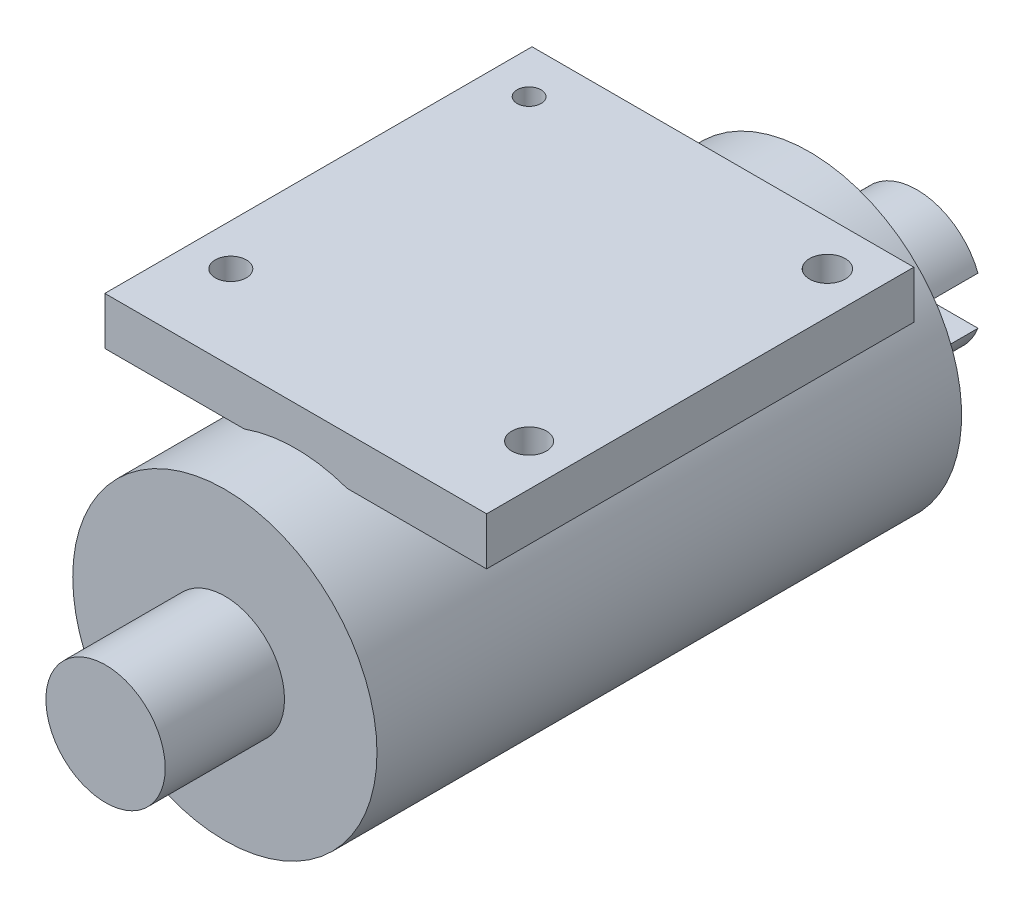
ISO-10303-21;
HEADER;
FILE_DESCRIPTION(('STEP AP214'),'2;1');
FILE_NAME('part.step','',(''),(''),'','','');
FILE_SCHEMA(('AUTOMOTIVE_DESIGN { 1 0 10303 214 1 1 1 1 }'));
ENDSEC;
DATA;
#1=APPLICATION_CONTEXT('core data for automotive mechanical design processes');
#2=APPLICATION_PROTOCOL_DEFINITION('international standard','automotive_design',2000,#1);
#3=PRODUCT_CONTEXT('',#1,'mechanical');
#4=PRODUCT('Part','Part','',(#3));
#5=PRODUCT_RELATED_PRODUCT_CATEGORY('part','',(#4));
#6=PRODUCT_DEFINITION_FORMATION('','',#4);
#7=PRODUCT_DEFINITION_CONTEXT('part definition',#1,'design');
#8=PRODUCT_DEFINITION('design','',#6,#7);
#9=PRODUCT_DEFINITION_SHAPE('','',#8);
#10=(LENGTH_UNIT() NAMED_UNIT(*) SI_UNIT(.MILLI.,.METRE.));
#11=(NAMED_UNIT(*) PLANE_ANGLE_UNIT() SI_UNIT($,.RADIAN.));
#12=(NAMED_UNIT(*) SI_UNIT($,.STERADIAN.) SOLID_ANGLE_UNIT());
#13=UNCERTAINTY_MEASURE_WITH_UNIT(LENGTH_MEASURE(1.E-05),#10,'distance_accuracy_value','');
#14=(GEOMETRIC_REPRESENTATION_CONTEXT(3) GLOBAL_UNCERTAINTY_ASSIGNED_CONTEXT((#13)) GLOBAL_UNIT_ASSIGNED_CONTEXT((#10,
#11,#12)) REPRESENTATION_CONTEXT('',''));
#15=CARTESIAN_POINT('',(0.,0.,0.));
#16=DIRECTION('',(0.,0.,1.));
#17=DIRECTION('',(1.,0.,0.));
#18=AXIS2_PLACEMENT_3D('',#15,#16,#17);
#19=CARTESIAN_POINT('',(0.,0.,116.));
#20=DIRECTION('',(0.,0.,1.));
#21=DIRECTION('',(1.,0.,0.));
#22=AXIS2_PLACEMENT_3D('',#19,#20,#21);
#23=PLANE('',#22);
#24=CARTESIAN_POINT('',(0.,0.,116.));
#25=DIRECTION('',(0.,0.,1.));
#26=DIRECTION('',(1.,0.,0.));
#27=AXIS2_PLACEMENT_3D('',#24,#25,#26);
#28=CIRCLE('',#27,25.5);
#29=CARTESIAN_POINT('',(25.5,0.,116.));
#30=VERTEX_POINT('',#29);
#31=EDGE_CURVE('E177',#30,#30,#28,.T.);
#32=ORIENTED_EDGE('',*,*,#31,.T.);
#33=EDGE_LOOP('',(#32));
#34=FACE_BOUND('',#33,.T.);
#35=CARTESIAN_POINT('',(0.,0.,116.));
#36=DIRECTION('',(0.,0.,1.));
#37=DIRECTION('',(1.,0.,0.));
#38=AXIS2_PLACEMENT_3D('',#35,#36,#37);
#39=CIRCLE('',#38,10.);
#40=CARTESIAN_POINT('',(10.,0.,116.));
#41=VERTEX_POINT('',#40);
#42=EDGE_CURVE('E311',#41,#41,#39,.T.);
#43=ORIENTED_EDGE('',*,*,#42,.F.);
#44=EDGE_LOOP('',(#43));
#45=FACE_BOUND('',#44,.T.);
#46=ADVANCED_FACE('F33',(#34,#45),#23,.T.);
#47=CARTESIAN_POINT('',(0.,0.,116.));
#48=DIRECTION('',(0.,0.,-1.));
#49=DIRECTION('',(-1.,0.,0.));
#50=AXIS2_PLACEMENT_3D('',#47,#48,#49);
#51=CYLINDRICAL_SURFACE('',#50,25.5);
#52=CARTESIAN_POINT('',(0.,0.,18.));
#53=DIRECTION('',(0.,0.,-1.));
#54=DIRECTION('',(-1.,0.,0.));
#55=AXIS2_PLACEMENT_3D('',#52,#53,#54);
#56=CIRCLE('',#55,25.5);
#57=CARTESIAN_POINT('',(-25.5,0.,18.));
#58=VERTEX_POINT('',#57);
#59=EDGE_CURVE('E173',#58,#58,#56,.T.);
#60=ORIENTED_EDGE('',*,*,#59,.F.);
#61=EDGE_LOOP('',(#60));
#62=FACE_BOUND('',#61,.T.);
#63=ORIENTED_EDGE('',*,*,#31,.F.);
#64=EDGE_LOOP('',(#63));
#65=FACE_BOUND('',#64,.T.);
#66=DIRECTION('',(0.,0.,-1.));
#67=VECTOR('',#66,1.);
#68=CARTESIAN_POINT('',(8.61684396980703,24.,116.));
#69=LINE('',#68,#67);
#70=CARTESIAN_POINT('',(8.61684396980704,24.,104.119231033455));
#71=VERTEX_POINT('',#70);
#72=CARTESIAN_POINT('',(8.61684396980704,24.,32.51129718235));
#73=VERTEX_POINT('',#72);
#74=EDGE_CURVE('E12',#71,#73,#69,.T.);
#75=ORIENTED_EDGE('',*,*,#74,.F.);
#76=CARTESIAN_POINT('',(0.,0.,104.119231033455));
#77=DIRECTION('',(0.,0.,1.));
#78=DIRECTION('',(1.,0.,0.));
#79=AXIS2_PLACEMENT_3D('',#76,#77,#78);
#80=CIRCLE('',#79,25.5);
#81=CARTESIAN_POINT('',(-8.61684396980703,24.,104.119231033455));
#82=VERTEX_POINT('',#81);
#83=EDGE_CURVE('E192',#71,#82,#80,.T.);
#84=ORIENTED_EDGE('',*,*,#83,.T.);
#85=DIRECTION('',(0.,0.,-1.));
#86=VECTOR('',#85,1.);
#87=CARTESIAN_POINT('',(-8.61684396980703,24.,116.));
#88=LINE('',#87,#86);
#89=CARTESIAN_POINT('',(-8.61684396980703,24.,32.51129718235));
#90=VERTEX_POINT('',#89);
#91=EDGE_CURVE('E124',#90,#82,#88,.F.);
#92=ORIENTED_EDGE('',*,*,#91,.F.);
#93=CARTESIAN_POINT('',(0.,0.,32.51129718235));
#94=DIRECTION('',(0.,0.,-1.));
#95=DIRECTION('',(-1.,0.,0.));
#96=AXIS2_PLACEMENT_3D('',#93,#94,#95);
#97=CIRCLE('',#96,25.5);
#98=EDGE_CURVE('E41',#90,#73,#97,.T.);
#99=ORIENTED_EDGE('',*,*,#98,.T.);
#100=EDGE_LOOP('',(#75,#84,#92,#99));
#101=FACE_BOUND('',#100,.T.);
#102=ADVANCED_FACE('F35',(#62,#65,#101),#51,.T.);
#103=CARTESIAN_POINT('',(0.,0.,0.));
#104=DIRECTION('',(0.,0.,1.));
#105=DIRECTION('',(1.,0.,0.));
#106=AXIS2_PLACEMENT_3D('',#103,#104,#105);
#107=PLANE('',#106);
#108=CARTESIAN_POINT('',(0.,0.,0.));
#109=DIRECTION('',(0.,0.,-1.));
#110=DIRECTION('',(-1.,0.,0.));
#111=AXIS2_PLACEMENT_3D('',#108,#109,#110);
#112=CIRCLE('',#111,11.);
#113=CARTESIAN_POINT('',(-10.2469507659596,4.,0.));
#114=VERTEX_POINT('',#113);
#115=CARTESIAN_POINT('',(10.2469507659596,4.,0.));
#116=VERTEX_POINT('',#115);
#117=EDGE_CURVE('E174',#114,#116,#112,.T.);
#118=ORIENTED_EDGE('',*,*,#117,.T.);
#119=DIRECTION('',(-1.,0.,0.));
#120=VECTOR('',#119,1.);
#121=CARTESIAN_POINT('',(0.,4.,0.));
#122=LINE('',#121,#120);
#123=EDGE_CURVE('E185',#116,#114,#122,.T.);
#124=ORIENTED_EDGE('',*,*,#123,.T.);
#125=EDGE_LOOP('',(#118,#124));
#126=FACE_BOUND('',#125,.T.);
#127=ADVANCED_FACE('F226',(#126),#107,.F.);
#128=CARTESIAN_POINT('',(0.,0.,18.));
#129=DIRECTION('',(0.,0.,-1.));
#130=DIRECTION('',(-1.,0.,0.));
#131=AXIS2_PLACEMENT_3D('',#128,#129,#130);
#132=PLANE('',#131);
#133=CARTESIAN_POINT('',(0.,0.,18.));
#134=DIRECTION('',(0.,0.,-1.));
#135=DIRECTION('',(-1.,0.,0.));
#136=AXIS2_PLACEMENT_3D('',#133,#134,#135);
#137=CIRCLE('',#136,11.);
#138=CARTESIAN_POINT('',(-11.,0.,18.));
#139=VERTEX_POINT('',#138);
#140=EDGE_CURVE('E170',#139,#139,#137,.T.);
#141=ORIENTED_EDGE('',*,*,#140,.F.);
#142=EDGE_LOOP('',(#141));
#143=FACE_BOUND('',#142,.T.);
#144=ORIENTED_EDGE('',*,*,#59,.T.);
#145=EDGE_LOOP('',(#144));
#146=FACE_BOUND('',#145,.T.);
#147=ADVANCED_FACE('F230',(#143,#146),#132,.T.);
#148=CARTESIAN_POINT('',(0.,0.,18.));
#149=DIRECTION('',(0.,0.,-1.));
#150=DIRECTION('',(-1.,0.,0.));
#151=AXIS2_PLACEMENT_3D('',#148,#149,#150);
#152=CYLINDRICAL_SURFACE('',#151,11.);
#153=DIRECTION('',(0.,0.,-1.));
#154=VECTOR('',#153,1.);
#155=CARTESIAN_POINT('',(-10.2469507659596,4.,18.));
#156=LINE('',#155,#154);
#157=CARTESIAN_POINT('',(-10.2469507659596,4.,12.));
#158=VERTEX_POINT('',#157);
#159=EDGE_CURVE('E165',#158,#114,#156,.T.);
#160=ORIENTED_EDGE('',*,*,#159,.F.);
#161=CARTESIAN_POINT('',(0.,0.,12.));
#162=DIRECTION('',(0.,0.,1.));
#163=DIRECTION('',(1.,0.,0.));
#164=AXIS2_PLACEMENT_3D('',#161,#162,#163);
#165=CIRCLE('',#164,11.);
#166=CARTESIAN_POINT('',(-10.2469507659596,-4.,12.));
#167=VERTEX_POINT('',#166);
#168=EDGE_CURVE('E190',#167,#158,#165,.F.);
#169=ORIENTED_EDGE('',*,*,#168,.F.);
#170=DIRECTION('',(0.,0.,-1.));
#171=VECTOR('',#170,1.);
#172=CARTESIAN_POINT('',(-10.2469507659596,-4.,18.));
#173=LINE('',#172,#171);
#174=CARTESIAN_POINT('',(-10.2469507659596,-4.,0.));
#175=VERTEX_POINT('',#174);
#176=EDGE_CURVE('E163',#175,#167,#173,.F.);
#177=ORIENTED_EDGE('',*,*,#176,.F.);
#178=CARTESIAN_POINT('',(10.2469507659596,-4.,0.));
#179=VERTEX_POINT('',#178);
#180=EDGE_CURVE('E169',#179,#175,#112,.T.);
#181=ORIENTED_EDGE('',*,*,#180,.F.);
#182=DIRECTION('',(0.,0.,-1.));
#183=VECTOR('',#182,1.);
#184=CARTESIAN_POINT('',(10.2469507659596,-4.,18.));
#185=LINE('',#184,#183);
#186=CARTESIAN_POINT('',(10.2469507659596,-4.,12.));
#187=VERTEX_POINT('',#186);
#188=EDGE_CURVE('E161',#187,#179,#185,.T.);
#189=ORIENTED_EDGE('',*,*,#188,.F.);
#190=CARTESIAN_POINT('',(10.2469507659596,4.,12.));
#191=VERTEX_POINT('',#190);
#192=EDGE_CURVE('E188',#191,#187,#165,.F.);
#193=ORIENTED_EDGE('',*,*,#192,.F.);
#194=DIRECTION('',(0.,0.,-1.));
#195=VECTOR('',#194,1.);
#196=CARTESIAN_POINT('',(10.2469507659596,4.,18.));
#197=LINE('',#196,#195);
#198=EDGE_CURVE('E167',#116,#191,#197,.F.);
#199=ORIENTED_EDGE('',*,*,#198,.F.);
#200=ORIENTED_EDGE('',*,*,#117,.F.);
#201=EDGE_LOOP('',(#160,#169,#177,#181,#189,#193,#199,#200));
#202=FACE_BOUND('',#201,.T.);
#203=ORIENTED_EDGE('',*,*,#140,.T.);
#204=EDGE_LOOP('',(#203));
#205=FACE_BOUND('',#204,.T.);
#206=ADVANCED_FACE('F235',(#202,#205),#152,.T.);
#207=ORIENTED_EDGE('',*,*,#180,.T.);
#208=DIRECTION('',(1.,0.,0.));
#209=VECTOR('',#208,1.);
#210=CARTESIAN_POINT('',(0.,-4.,0.));
#211=LINE('',#210,#209);
#212=EDGE_CURVE('E180',#175,#179,#211,.T.);
#213=ORIENTED_EDGE('',*,*,#212,.T.);
#214=EDGE_LOOP('',(#207,#213));
#215=FACE_BOUND('',#214,.T.);
#216=ADVANCED_FACE('F232',(#215),#107,.F.);
#217=CARTESIAN_POINT('',(20.3856403488771,4.,12.));
#218=DIRECTION('',(0.,1.,0.));
#219=DIRECTION('',(0.,0.,1.));
#220=AXIS2_PLACEMENT_3D('',#217,#218,#219);
#221=PLANE('',#220);
#222=ORIENTED_EDGE('',*,*,#198,.T.);
#223=DIRECTION('',(1.,0.,0.));
#224=VECTOR('',#223,1.);
#225=CARTESIAN_POINT('',(20.3856403488771,4.,12.));
#226=LINE('',#225,#224);
#227=EDGE_CURVE('E158',#158,#191,#226,.T.);
#228=ORIENTED_EDGE('',*,*,#227,.F.);
#229=ORIENTED_EDGE('',*,*,#159,.T.);
#230=ORIENTED_EDGE('',*,*,#123,.F.);
#231=EDGE_LOOP('',(#222,#228,#229,#230));
#232=FACE_BOUND('',#231,.T.);
#233=ADVANCED_FACE('F234',(#232),#221,.F.);
#234=CARTESIAN_POINT('',(20.3856403488771,-4.,12.));
#235=DIRECTION('',(0.,-1.,0.));
#236=DIRECTION('',(0.,0.,-1.));
#237=AXIS2_PLACEMENT_3D('',#234,#235,#236);
#238=PLANE('',#237);
#239=ORIENTED_EDGE('',*,*,#176,.T.);
#240=DIRECTION('',(-1.,0.,0.));
#241=VECTOR('',#240,1.);
#242=CARTESIAN_POINT('',(20.3856403488771,-4.,12.));
#243=LINE('',#242,#241);
#244=EDGE_CURVE('E152',#187,#167,#243,.T.);
#245=ORIENTED_EDGE('',*,*,#244,.F.);
#246=ORIENTED_EDGE('',*,*,#188,.T.);
#247=ORIENTED_EDGE('',*,*,#212,.F.);
#248=EDGE_LOOP('',(#239,#245,#246,#247));
#249=FACE_BOUND('',#248,.T.);
#250=ADVANCED_FACE('F215',(#249),#238,.F.);
#251=CARTESIAN_POINT('',(20.3856403488771,4.,12.));
#252=DIRECTION('',(0.,0.,1.));
#253=DIRECTION('',(1.,0.,0.));
#254=AXIS2_PLACEMENT_3D('',#251,#252,#253);
#255=PLANE('',#254);
#256=ORIENTED_EDGE('',*,*,#168,.T.);
#257=ORIENTED_EDGE('',*,*,#227,.T.);
#258=ORIENTED_EDGE('',*,*,#192,.T.);
#259=ORIENTED_EDGE('',*,*,#244,.T.);
#260=EDGE_LOOP('',(#256,#257,#258,#259));
#261=FACE_BOUND('',#260,.T.);
#262=ADVANCED_FACE('F208',(#261),#255,.F.);
#263=CARTESIAN_POINT('',(-32.,24.,32.51129718235));
#264=DIRECTION('',(0.,0.,-1.));
#265=DIRECTION('',(-1.,0.,0.));
#266=AXIS2_PLACEMENT_3D('',#263,#264,#265);
#267=PLANE('',#266);
#268=ORIENTED_EDGE('',*,*,#98,.F.);
#269=DIRECTION('',(-1.,0.,0.));
#270=VECTOR('',#269,1.);
#271=CARTESIAN_POINT('',(-32.,24.,32.51129718235));
#272=LINE('',#271,#270);
#273=CARTESIAN_POINT('',(-32.,24.,32.51129718235));
#274=VERTEX_POINT('',#273);
#275=EDGE_CURVE('E142',#90,#274,#272,.T.);
#276=ORIENTED_EDGE('',*,*,#275,.T.);
#277=DIRECTION('',(0.,1.,0.));
#278=VECTOR('',#277,1.);
#279=CARTESIAN_POINT('',(-32.,24.,32.51129718235));
#280=LINE('',#279,#278);
#281=CARTESIAN_POINT('',(-32.,32.,32.51129718235));
#282=VERTEX_POINT('',#281);
#283=EDGE_CURVE('E130',#274,#282,#280,.T.);
#284=ORIENTED_EDGE('',*,*,#283,.T.);
#285=DIRECTION('',(-1.,0.,0.));
#286=VECTOR('',#285,1.);
#287=CARTESIAN_POINT('',(-32.,32.,32.51129718235));
#288=LINE('',#287,#286);
#289=CARTESIAN_POINT('',(32.,32.,32.51129718235));
#290=VERTEX_POINT('',#289);
#291=EDGE_CURVE('E131',#290,#282,#288,.T.);
#292=ORIENTED_EDGE('',*,*,#291,.F.);
#293=DIRECTION('',(0.,1.,0.));
#294=VECTOR('',#293,1.);
#295=CARTESIAN_POINT('',(32.,24.,32.51129718235));
#296=LINE('',#295,#294);
#297=CARTESIAN_POINT('',(32.,24.,32.51129718235));
#298=VERTEX_POINT('',#297);
#299=EDGE_CURVE('E153',#298,#290,#296,.T.);
#300=ORIENTED_EDGE('',*,*,#299,.F.);
#301=EDGE_CURVE('E116',#298,#73,#272,.T.);
#302=ORIENTED_EDGE('',*,*,#301,.T.);
#303=EDGE_LOOP('',(#268,#276,#284,#292,#300,#302));
#304=FACE_BOUND('',#303,.T.);
#305=ADVANCED_FACE('F206',(#304),#267,.T.);
#306=CARTESIAN_POINT('',(-32.,24.,104.119231033455));
#307=DIRECTION('',(0.,0.,1.));
#308=DIRECTION('',(1.,0.,0.));
#309=AXIS2_PLACEMENT_3D('',#306,#307,#308);
#310=PLANE('',#309);
#311=ORIENTED_EDGE('',*,*,#83,.F.);
#312=DIRECTION('',(1.,0.,0.));
#313=VECTOR('',#312,1.);
#314=CARTESIAN_POINT('',(-32.,24.,104.119231033455));
#315=LINE('',#314,#313);
#316=CARTESIAN_POINT('',(32.,24.,104.119231033455));
#317=VERTEX_POINT('',#316);
#318=EDGE_CURVE('E126',#71,#317,#315,.T.);
#319=ORIENTED_EDGE('',*,*,#318,.T.);
#320=DIRECTION('',(0.,1.,0.));
#321=VECTOR('',#320,1.);
#322=CARTESIAN_POINT('',(32.,24.,104.119231033455));
#323=LINE('',#322,#321);
#324=CARTESIAN_POINT('',(32.,32.,104.119231033455));
#325=VERTEX_POINT('',#324);
#326=EDGE_CURVE('E115',#317,#325,#323,.T.);
#327=ORIENTED_EDGE('',*,*,#326,.T.);
#328=DIRECTION('',(1.,0.,0.));
#329=VECTOR('',#328,1.);
#330=CARTESIAN_POINT('',(-32.,32.,104.119231033455));
#331=LINE('',#330,#329);
#332=CARTESIAN_POINT('',(-32.,32.,104.119231033455));
#333=VERTEX_POINT('',#332);
#334=EDGE_CURVE('E110',#333,#325,#331,.T.);
#335=ORIENTED_EDGE('',*,*,#334,.F.);
#336=DIRECTION('',(0.,1.,0.));
#337=VECTOR('',#336,1.);
#338=CARTESIAN_POINT('',(-32.,24.,104.119231033455));
#339=LINE('',#338,#337);
#340=CARTESIAN_POINT('',(-32.,24.,104.119231033455));
#341=VERTEX_POINT('',#340);
#342=EDGE_CURVE('E105',#341,#333,#339,.T.);
#343=ORIENTED_EDGE('',*,*,#342,.F.);
#344=EDGE_CURVE('E108',#341,#82,#315,.T.);
#345=ORIENTED_EDGE('',*,*,#344,.T.);
#346=EDGE_LOOP('',(#311,#319,#327,#335,#343,#345));
#347=FACE_BOUND('',#346,.T.);
#348=ADVANCED_FACE('F107',(#347),#310,.T.);
#349=CARTESIAN_POINT('',(-32.,24.,104.119231033455));
#350=DIRECTION('',(0.,1.,0.));
#351=DIRECTION('',(0.,0.,1.));
#352=AXIS2_PLACEMENT_3D('',#349,#350,#351);
#353=PLANE('',#352);
#354=CARTESIAN_POINT('',(25.,24.,90.));
#355=DIRECTION('',(0.,1.,0.));
#356=DIRECTION('',(0.,0.,1.));
#357=AXIS2_PLACEMENT_3D('',#354,#355,#356);
#358=CIRCLE('',#357,2.91025978255613);
#359=CARTESIAN_POINT('',(25.,24.,92.9102597825561));
#360=VERTEX_POINT('',#359);
#361=EDGE_CURVE('E147',#360,#360,#358,.T.);
#362=ORIENTED_EDGE('',*,*,#361,.T.);
#363=EDGE_LOOP('',(#362));
#364=FACE_BOUND('',#363,.T.);
#365=CARTESIAN_POINT('',(25.,24.,40.));
#366=DIRECTION('',(0.,1.,0.));
#367=DIRECTION('',(0.,0.,1.));
#368=AXIS2_PLACEMENT_3D('',#365,#366,#367);
#369=CIRCLE('',#368,2.98778185505247);
#370=CARTESIAN_POINT('',(25.,24.,42.9877818550525));
#371=VERTEX_POINT('',#370);
#372=EDGE_CURVE('E328',#371,#371,#369,.T.);
#373=ORIENTED_EDGE('',*,*,#372,.T.);
#374=EDGE_LOOP('',(#373));
#375=FACE_BOUND('',#374,.T.);
#376=ORIENTED_EDGE('',*,*,#318,.F.);
#377=ORIENTED_EDGE('',*,*,#74,.T.);
#378=ORIENTED_EDGE('',*,*,#301,.F.);
#379=DIRECTION('',(0.,0.,-1.));
#380=VECTOR('',#379,1.);
#381=CARTESIAN_POINT('',(32.,24.,32.51129718235));
#382=LINE('',#381,#380);
#383=EDGE_CURVE('E125',#317,#298,#382,.T.);
#384=ORIENTED_EDGE('',*,*,#383,.F.);
#385=EDGE_LOOP('',(#376,#377,#378,#384));
#386=FACE_BOUND('',#385,.T.);
#387=ADVANCED_FACE('F197',(#364,#375,#386),#353,.F.);
#388=CARTESIAN_POINT('',(-25.,24.,90.));
#389=DIRECTION('',(0.,1.,0.));
#390=DIRECTION('',(0.,0.,1.));
#391=AXIS2_PLACEMENT_3D('',#388,#389,#390);
#392=CIRCLE('',#391,2.61053262922795);
#393=CARTESIAN_POINT('',(-25.,24.,92.6105326292279));
#394=VERTEX_POINT('',#393);
#395=EDGE_CURVE('E322',#394,#394,#392,.T.);
#396=ORIENTED_EDGE('',*,*,#395,.T.);
#397=EDGE_LOOP('',(#396));
#398=FACE_BOUND('',#397,.T.);
#399=CARTESIAN_POINT('',(-25.,24.,40.));
#400=DIRECTION('',(0.,1.,0.));
#401=DIRECTION('',(0.,0.,1.));
#402=AXIS2_PLACEMENT_3D('',#399,#400,#401);
#403=CIRCLE('',#402,2.00697896769482);
#404=CARTESIAN_POINT('',(-25.,24.,42.0069789676948));
#405=VERTEX_POINT('',#404);
#406=EDGE_CURVE('E314',#405,#405,#403,.T.);
#407=ORIENTED_EDGE('',*,*,#406,.T.);
#408=EDGE_LOOP('',(#407));
#409=FACE_BOUND('',#408,.T.);
#410=ORIENTED_EDGE('',*,*,#275,.F.);
#411=ORIENTED_EDGE('',*,*,#91,.T.);
#412=ORIENTED_EDGE('',*,*,#344,.F.);
#413=DIRECTION('',(0.,0.,1.));
#414=VECTOR('',#413,1.);
#415=CARTESIAN_POINT('',(-32.,24.,32.51129718235));
#416=LINE('',#415,#414);
#417=EDGE_CURVE('E123',#274,#341,#416,.T.);
#418=ORIENTED_EDGE('',*,*,#417,.F.);
#419=EDGE_LOOP('',(#410,#411,#412,#418));
#420=FACE_BOUND('',#419,.T.);
#421=ADVANCED_FACE('F122',(#398,#409,#420),#353,.F.);
#422=CARTESIAN_POINT('',(-32.,24.,32.51129718235));
#423=DIRECTION('',(-1.,0.,0.));
#424=DIRECTION('',(0.,0.,1.));
#425=AXIS2_PLACEMENT_3D('',#422,#423,#424);
#426=PLANE('',#425);
#427=DIRECTION('',(0.,0.,1.));
#428=VECTOR('',#427,1.);
#429=CARTESIAN_POINT('',(-32.,32.,32.51129718235));
#430=LINE('',#429,#428);
#431=EDGE_CURVE('E145',#282,#333,#430,.T.);
#432=ORIENTED_EDGE('',*,*,#431,.F.);
#433=ORIENTED_EDGE('',*,*,#283,.F.);
#434=ORIENTED_EDGE('',*,*,#417,.T.);
#435=ORIENTED_EDGE('',*,*,#342,.T.);
#436=EDGE_LOOP('',(#432,#433,#434,#435));
#437=FACE_BOUND('',#436,.T.);
#438=ADVANCED_FACE('F129',(#437),#426,.T.);
#439=CARTESIAN_POINT('',(32.,24.,32.51129718235));
#440=DIRECTION('',(1.,0.,0.));
#441=DIRECTION('',(0.,0.,-1.));
#442=AXIS2_PLACEMENT_3D('',#439,#440,#441);
#443=PLANE('',#442);
#444=DIRECTION('',(0.,0.,-1.));
#445=VECTOR('',#444,1.);
#446=CARTESIAN_POINT('',(32.,32.,32.51129718235));
#447=LINE('',#446,#445);
#448=EDGE_CURVE('E134',#325,#290,#447,.T.);
#449=ORIENTED_EDGE('',*,*,#448,.F.);
#450=ORIENTED_EDGE('',*,*,#326,.F.);
#451=ORIENTED_EDGE('',*,*,#383,.T.);
#452=ORIENTED_EDGE('',*,*,#299,.T.);
#453=EDGE_LOOP('',(#449,#450,#451,#452));
#454=FACE_BOUND('',#453,.T.);
#455=ADVANCED_FACE('F201',(#454),#443,.T.);
#456=CARTESIAN_POINT('',(-32.,32.,104.119231033455));
#457=DIRECTION('',(0.,1.,0.));
#458=DIRECTION('',(0.,0.,1.));
#459=AXIS2_PLACEMENT_3D('',#456,#457,#458);
#460=PLANE('',#459);
#461=CARTESIAN_POINT('',(-25.,32.,40.));
#462=DIRECTION('',(0.,1.,0.));
#463=DIRECTION('',(0.,0.,1.));
#464=AXIS2_PLACEMENT_3D('',#461,#462,#463);
#465=CIRCLE('',#464,2.00697896769482);
#466=CARTESIAN_POINT('',(-25.,32.,42.0069789676948));
#467=VERTEX_POINT('',#466);
#468=EDGE_CURVE('E310',#467,#467,#465,.T.);
#469=ORIENTED_EDGE('',*,*,#468,.F.);
#470=EDGE_LOOP('',(#469));
#471=FACE_BOUND('',#470,.T.);
#472=CARTESIAN_POINT('',(-25.,32.,90.));
#473=DIRECTION('',(0.,1.,0.));
#474=DIRECTION('',(0.,0.,1.));
#475=AXIS2_PLACEMENT_3D('',#472,#473,#474);
#476=CIRCLE('',#475,2.61053262922795);
#477=CARTESIAN_POINT('',(-25.,32.,92.6105326292279));
#478=VERTEX_POINT('',#477);
#479=EDGE_CURVE('E320',#478,#478,#476,.T.);
#480=ORIENTED_EDGE('',*,*,#479,.F.);
#481=EDGE_LOOP('',(#480));
#482=FACE_BOUND('',#481,.T.);
#483=CARTESIAN_POINT('',(25.,32.,40.));
#484=DIRECTION('',(0.,1.,0.));
#485=DIRECTION('',(0.,0.,1.));
#486=AXIS2_PLACEMENT_3D('',#483,#484,#485);
#487=CIRCLE('',#486,2.98778185505247);
#488=CARTESIAN_POINT('',(25.,32.,42.9877818550525));
#489=VERTEX_POINT('',#488);
#490=EDGE_CURVE('E325',#489,#489,#487,.T.);
#491=ORIENTED_EDGE('',*,*,#490,.F.);
#492=EDGE_LOOP('',(#491));
#493=FACE_BOUND('',#492,.T.);
#494=CARTESIAN_POINT('',(25.,32.,90.));
#495=DIRECTION('',(0.,1.,0.));
#496=DIRECTION('',(0.,0.,1.));
#497=AXIS2_PLACEMENT_3D('',#494,#495,#496);
#498=CIRCLE('',#497,2.91025978255613);
#499=CARTESIAN_POINT('',(25.,32.,92.9102597825561));
#500=VERTEX_POINT('',#499);
#501=EDGE_CURVE('E137',#500,#500,#498,.T.);
#502=ORIENTED_EDGE('',*,*,#501,.F.);
#503=EDGE_LOOP('',(#502));
#504=FACE_BOUND('',#503,.T.);
#505=ORIENTED_EDGE('',*,*,#431,.T.);
#506=ORIENTED_EDGE('',*,*,#334,.T.);
#507=ORIENTED_EDGE('',*,*,#448,.T.);
#508=ORIENTED_EDGE('',*,*,#291,.T.);
#509=EDGE_LOOP('',(#505,#506,#507,#508));
#510=FACE_BOUND('',#509,.T.);
#511=ADVANCED_FACE('F204',(#471,#482,#493,#504,#510),#460,.T.);
#512=CARTESIAN_POINT('',(25.,24.,90.));
#513=DIRECTION('',(0.,1.,0.));
#514=DIRECTION('',(0.,0.,1.));
#515=AXIS2_PLACEMENT_3D('',#512,#513,#514);
#516=CYLINDRICAL_SURFACE('',#515,2.91025978255613);
#517=ORIENTED_EDGE('',*,*,#361,.F.);
#518=EDGE_LOOP('',(#517));
#519=FACE_BOUND('',#518,.T.);
#520=ORIENTED_EDGE('',*,*,#501,.T.);
#521=EDGE_LOOP('',(#520));
#522=FACE_BOUND('',#521,.T.);
#523=ADVANCED_FACE('F273',(#519,#522),#516,.F.);
#524=CARTESIAN_POINT('',(25.,24.,40.));
#525=DIRECTION('',(0.,1.,0.));
#526=DIRECTION('',(0.,0.,1.));
#527=AXIS2_PLACEMENT_3D('',#524,#525,#526);
#528=CYLINDRICAL_SURFACE('',#527,2.98778185505247);
#529=ORIENTED_EDGE('',*,*,#372,.F.);
#530=EDGE_LOOP('',(#529));
#531=FACE_BOUND('',#530,.T.);
#532=ORIENTED_EDGE('',*,*,#490,.T.);
#533=EDGE_LOOP('',(#532));
#534=FACE_BOUND('',#533,.T.);
#535=ADVANCED_FACE('F278',(#531,#534),#528,.F.);
#536=CARTESIAN_POINT('',(-25.,24.,90.));
#537=DIRECTION('',(0.,1.,0.));
#538=DIRECTION('',(0.,0.,1.));
#539=AXIS2_PLACEMENT_3D('',#536,#537,#538);
#540=CYLINDRICAL_SURFACE('',#539,2.61053262922795);
#541=ORIENTED_EDGE('',*,*,#395,.F.);
#542=EDGE_LOOP('',(#541));
#543=FACE_BOUND('',#542,.T.);
#544=ORIENTED_EDGE('',*,*,#479,.T.);
#545=EDGE_LOOP('',(#544));
#546=FACE_BOUND('',#545,.T.);
#547=ADVANCED_FACE('F289',(#543,#546),#540,.F.);
#548=CARTESIAN_POINT('',(-25.,24.,40.));
#549=DIRECTION('',(0.,1.,0.));
#550=DIRECTION('',(0.,0.,1.));
#551=AXIS2_PLACEMENT_3D('',#548,#549,#550);
#552=CYLINDRICAL_SURFACE('',#551,2.00697896769482);
#553=ORIENTED_EDGE('',*,*,#406,.F.);
#554=EDGE_LOOP('',(#553));
#555=FACE_BOUND('',#554,.T.);
#556=ORIENTED_EDGE('',*,*,#468,.T.);
#557=EDGE_LOOP('',(#556));
#558=FACE_BOUND('',#557,.T.);
#559=ADVANCED_FACE('F293',(#555,#558),#552,.F.);
#560=CARTESIAN_POINT('',(0.,0.,136.));
#561=DIRECTION('',(0.,0.,-1.));
#562=DIRECTION('',(-1.,0.,0.));
#563=AXIS2_PLACEMENT_3D('',#560,#561,#562);
#564=CYLINDRICAL_SURFACE('',#563,10.);
#565=CARTESIAN_POINT('',(0.,0.,136.));
#566=DIRECTION('',(0.,0.,1.));
#567=DIRECTION('',(1.,0.,0.));
#568=AXIS2_PLACEMENT_3D('',#565,#566,#567);
#569=CIRCLE('',#568,10.);
#570=CARTESIAN_POINT('',(10.,0.,136.));
#571=VERTEX_POINT('',#570);
#572=EDGE_CURVE('E309',#571,#571,#569,.T.);
#573=ORIENTED_EDGE('',*,*,#572,.F.);
#574=EDGE_LOOP('',(#573));
#575=FACE_BOUND('',#574,.T.);
#576=ORIENTED_EDGE('',*,*,#42,.T.);
#577=EDGE_LOOP('',(#576));
#578=FACE_BOUND('',#577,.T.);
#579=ADVANCED_FACE('F297',(#575,#578),#564,.T.);
#580=CARTESIAN_POINT('',(0.,0.,136.));
#581=DIRECTION('',(0.,0.,1.));
#582=DIRECTION('',(1.,0.,0.));
#583=AXIS2_PLACEMENT_3D('',#580,#581,#582);
#584=PLANE('',#583);
#585=ORIENTED_EDGE('',*,*,#572,.T.);
#586=EDGE_LOOP('',(#585));
#587=FACE_BOUND('',#586,.T.);
#588=ADVANCED_FACE('F301',(#587),#584,.T.);
#589=CLOSED_SHELL('',(#46,#102,#127,#147,#206,#216,#233,#250,#262,#305,#348,#387,#421,#438,#455,
#511,#523,#535,#547,#559,#579,#588));
#590=MANIFOLD_SOLID_BREP('B2',#589);
#591=ADVANCED_BREP_SHAPE_REPRESENTATION('',(#18,#590),#14);
#592=SHAPE_DEFINITION_REPRESENTATION(#9,#591);
ENDSEC;
END-ISO-10303-21;
